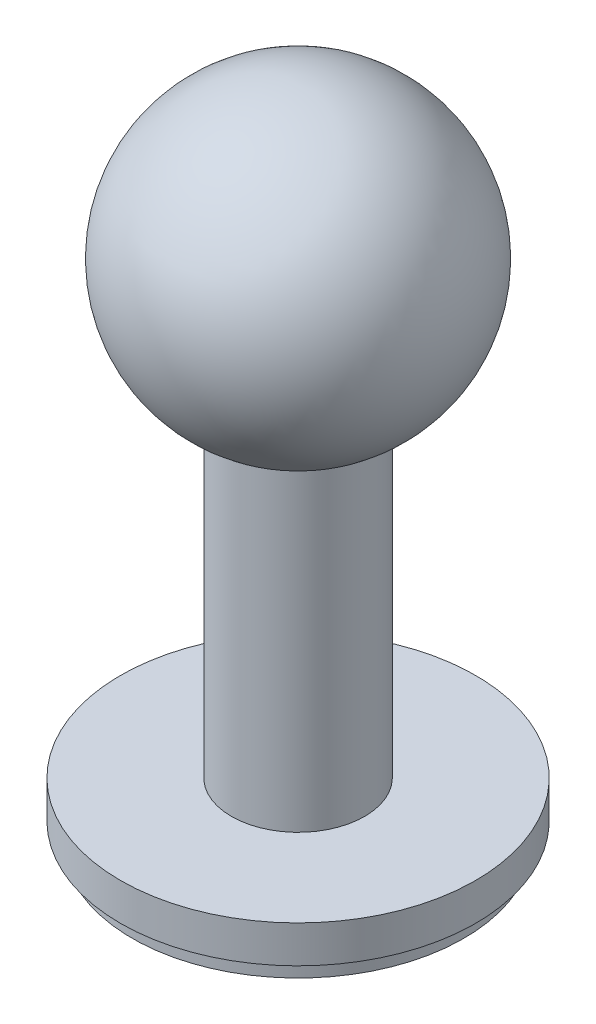
ISO-10303-21;
HEADER;
FILE_DESCRIPTION(('STEP AP214'),'2;1');
FILE_NAME('part.step','',(''),(''),'','','');
FILE_SCHEMA(('AUTOMOTIVE_DESIGN { 1 0 10303 214 1 1 1 1 }'));
ENDSEC;
DATA;
#1=APPLICATION_CONTEXT('core data for automotive mechanical design processes');
#2=APPLICATION_PROTOCOL_DEFINITION('international standard','automotive_design',2000,#1);
#3=PRODUCT_CONTEXT('',#1,'mechanical');
#4=PRODUCT('Part','Part','',(#3));
#5=PRODUCT_RELATED_PRODUCT_CATEGORY('part','',(#4));
#6=PRODUCT_DEFINITION_FORMATION('','',#4);
#7=PRODUCT_DEFINITION_CONTEXT('part definition',#1,'design');
#8=PRODUCT_DEFINITION('design','',#6,#7);
#9=PRODUCT_DEFINITION_SHAPE('','',#8);
#10=(LENGTH_UNIT() NAMED_UNIT(*) SI_UNIT(.MILLI.,.METRE.));
#11=(NAMED_UNIT(*) PLANE_ANGLE_UNIT() SI_UNIT($,.RADIAN.));
#12=(NAMED_UNIT(*) SI_UNIT($,.STERADIAN.) SOLID_ANGLE_UNIT());
#13=UNCERTAINTY_MEASURE_WITH_UNIT(LENGTH_MEASURE(1.E-05),#10,'distance_accuracy_value','');
#14=(GEOMETRIC_REPRESENTATION_CONTEXT(3) GLOBAL_UNCERTAINTY_ASSIGNED_CONTEXT((#13)) GLOBAL_UNIT_ASSIGNED_CONTEXT((#10,
#11,#12)) REPRESENTATION_CONTEXT('',''));
#15=CARTESIAN_POINT('',(0.,0.,0.));
#16=DIRECTION('',(0.,0.,1.));
#17=DIRECTION('',(1.,0.,0.));
#18=AXIS2_PLACEMENT_3D('',#15,#16,#17);
#19=CARTESIAN_POINT('',(0.,20.57,0.));
#20=DIRECTION('',(0.,-1.,0.));
#21=DIRECTION('',(0.,0.,-1.));
#22=AXIS2_PLACEMENT_3D('',#19,#20,#21);
#23=CYLINDRICAL_SURFACE('',#22,2.815);
#24=CARTESIAN_POINT('',(0.,1.57,0.));
#25=DIRECTION('',(0.,1.,0.));
#26=DIRECTION('',(0.,0.,1.));
#27=AXIS2_PLACEMENT_3D('',#24,#25,#26);
#28=CIRCLE('',#27,2.815);
#29=CARTESIAN_POINT('',(0.,1.57,2.815));
#30=VERTEX_POINT('',#29);
#31=EDGE_CURVE('E42',#30,#30,#28,.T.);
#32=ORIENTED_EDGE('',*,*,#31,.T.);
#33=EDGE_LOOP('',(#32));
#34=FACE_BOUND('',#33,.T.);
#35=CARTESIAN_POINT('',(0.,14.8780517395184,0.));
#36=DIRECTION('',(0.,1.,0.));
#37=DIRECTION('',(0.,0.,1.));
#38=AXIS2_PLACEMENT_3D('',#35,#36,#37);
#39=CIRCLE('',#38,2.815);
#40=CARTESIAN_POINT('',(0.,14.8780517395184,2.815));
#41=VERTEX_POINT('',#40);
#42=EDGE_CURVE('E34',#41,#41,#39,.T.);
#43=ORIENTED_EDGE('',*,*,#42,.F.);
#44=EDGE_LOOP('',(#43));
#45=FACE_BOUND('',#44,.T.);
#46=ADVANCED_FACE('F30',(#34,#45),#23,.T.);
#47=CARTESIAN_POINT('',(0.,1.57,0.));
#48=DIRECTION('',(0.,-1.,0.));
#49=DIRECTION('',(0.,0.,-1.));
#50=AXIS2_PLACEMENT_3D('',#47,#48,#49);
#51=CYLINDRICAL_SURFACE('',#50,7.5);
#52=CARTESIAN_POINT('',(0.,1.57,0.));
#53=DIRECTION('',(0.,1.,0.));
#54=DIRECTION('',(0.,0.,1.));
#55=AXIS2_PLACEMENT_3D('',#52,#53,#54);
#56=CIRCLE('',#55,7.5);
#57=CARTESIAN_POINT('',(0.,1.57,7.5));
#58=VERTEX_POINT('',#57);
#59=EDGE_CURVE('E48',#58,#58,#56,.T.);
#60=ORIENTED_EDGE('',*,*,#59,.F.);
#61=EDGE_LOOP('',(#60));
#62=FACE_BOUND('',#61,.T.);
#63=CARTESIAN_POINT('',(0.,0.,0.));
#64=DIRECTION('',(0.,1.,0.));
#65=DIRECTION('',(0.,0.,1.));
#66=AXIS2_PLACEMENT_3D('',#63,#64,#65);
#67=CIRCLE('',#66,7.5);
#68=CARTESIAN_POINT('',(0.,0.,7.5));
#69=VERTEX_POINT('',#68);
#70=EDGE_CURVE('E50',#69,#69,#67,.T.);
#71=ORIENTED_EDGE('',*,*,#70,.T.);
#72=EDGE_LOOP('',(#71));
#73=FACE_BOUND('',#72,.T.);
#74=ADVANCED_FACE('F32',(#62,#73),#51,.T.);
#75=CARTESIAN_POINT('',(0.,1.57,0.));
#76=DIRECTION('',(0.,1.,0.));
#77=DIRECTION('',(0.,0.,1.));
#78=AXIS2_PLACEMENT_3D('',#75,#76,#77);
#79=PLANE('',#78);
#80=ORIENTED_EDGE('',*,*,#31,.F.);
#81=EDGE_LOOP('',(#80));
#82=FACE_BOUND('',#81,.T.);
#83=ORIENTED_EDGE('',*,*,#59,.T.);
#84=EDGE_LOOP('',(#83));
#85=FACE_BOUND('',#84,.T.);
#86=ADVANCED_FACE('F77',(#82,#85),#79,.T.);
#87=CARTESIAN_POINT('',(0.,0.,0.));
#88=DIRECTION('',(0.,1.,0.));
#89=DIRECTION('',(0.,0.,1.));
#90=AXIS2_PLACEMENT_3D('',#87,#88,#89);
#91=PLANE('',#90);
#92=CARTESIAN_POINT('',(0.,0.,0.));
#93=DIRECTION('',(0.,-1.,0.));
#94=DIRECTION('',(0.,0.,-1.));
#95=AXIS2_PLACEMENT_3D('',#92,#93,#94);
#96=CIRCLE('',#95,7.);
#97=CARTESIAN_POINT('',(0.,0.,-7.));
#98=VERTEX_POINT('',#97);
#99=EDGE_CURVE('E10',#98,#98,#96,.T.);
#100=ORIENTED_EDGE('',*,*,#99,.F.);
#101=EDGE_LOOP('',(#100));
#102=FACE_BOUND('',#101,.T.);
#103=ORIENTED_EDGE('',*,*,#70,.F.);
#104=EDGE_LOOP('',(#103));
#105=FACE_BOUND('',#104,.T.);
#106=ADVANCED_FACE('F68',(#102,#105),#91,.F.);
#107=CARTESIAN_POINT('',(0.,20.57,0.));
#108=DIRECTION('',(0.,0.,-1.));
#109=DIRECTION('',(1.,0.,0.));
#110=AXIS2_PLACEMENT_3D('',#107,#108,#109);
#111=SPHERICAL_SURFACE('',#110,6.35);
#112=CARTESIAN_POINT('',(0.,20.57,0.));
#113=DIRECTION('',(0.,1.,0.));
#114=DIRECTION('',(0.,0.,1.));
#115=AXIS2_PLACEMENT_3D('',#112,#113,#114);
#116=SPHERICAL_SURFACE('',#115,6.35);
#117=ORIENTED_EDGE('',*,*,#42,.T.);
#118=EDGE_LOOP('',(#117));
#119=FACE_BOUND('',#118,.T.);
#120=ADVANCED_FACE('F61',(#119),#116,.T.);
#121=CARTESIAN_POINT('',(0.,-0.8,0.));
#122=DIRECTION('',(0.,1.,0.));
#123=DIRECTION('',(0.,0.,1.));
#124=AXIS2_PLACEMENT_3D('',#121,#122,#123);
#125=CYLINDRICAL_SURFACE('',#124,7.);
#126=CARTESIAN_POINT('',(0.,-0.8,0.));
#127=DIRECTION('',(0.,-1.,0.));
#128=DIRECTION('',(0.,0.,-1.));
#129=AXIS2_PLACEMENT_3D('',#126,#127,#128);
#130=CIRCLE('',#129,7.);
#131=CARTESIAN_POINT('',(0.,-0.8,-7.));
#132=VERTEX_POINT('',#131);
#133=EDGE_CURVE('E45',#132,#132,#130,.T.);
#134=ORIENTED_EDGE('',*,*,#133,.F.);
#135=EDGE_LOOP('',(#134));
#136=FACE_BOUND('',#135,.T.);
#137=ORIENTED_EDGE('',*,*,#99,.T.);
#138=EDGE_LOOP('',(#137));
#139=FACE_BOUND('',#138,.T.);
#140=ADVANCED_FACE('F59',(#136,#139),#125,.T.);
#141=CARTESIAN_POINT('',(0.,-0.8,0.));
#142=DIRECTION('',(0.,-1.,0.));
#143=DIRECTION('',(0.,0.,-1.));
#144=AXIS2_PLACEMENT_3D('',#141,#142,#143);
#145=PLANE('',#144);
#146=ORIENTED_EDGE('',*,*,#133,.T.);
#147=EDGE_LOOP('',(#146));
#148=FACE_BOUND('',#147,.T.);
#149=ADVANCED_FACE('F57',(#148),#145,.T.);
#150=CLOSED_SHELL('',(#46,#74,#86,#106,#120,#140,#149));
#151=MANIFOLD_SOLID_BREP('B2',#150);
#152=ADVANCED_BREP_SHAPE_REPRESENTATION('',(#18,#151),#14);
#153=SHAPE_DEFINITION_REPRESENTATION(#9,#152);
ENDSEC;
END-ISO-10303-21;
